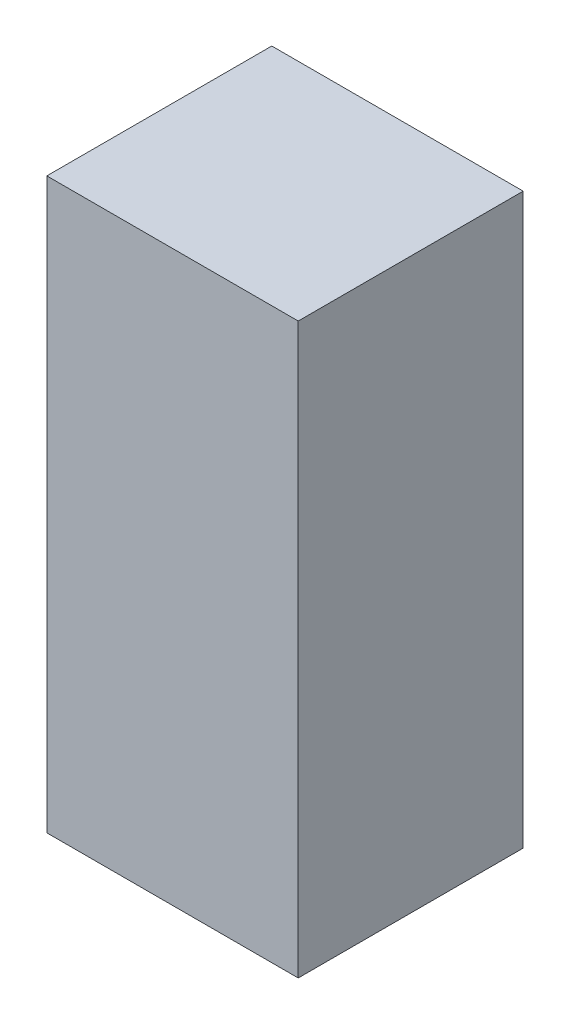
ISO-10303-21;
HEADER;
FILE_DESCRIPTION(('STEP AP214'),'2;1');
FILE_NAME('part.step','',(''),(''),'','','');
FILE_SCHEMA(('AUTOMOTIVE_DESIGN { 1 0 10303 214 1 1 1 1 }'));
ENDSEC;
DATA;
#1=APPLICATION_CONTEXT('core data for automotive mechanical design processes');
#2=APPLICATION_PROTOCOL_DEFINITION('international standard','automotive_design',2000,#1);
#3=PRODUCT_CONTEXT('',#1,'mechanical');
#4=PRODUCT('Part','Part','',(#3));
#5=PRODUCT_RELATED_PRODUCT_CATEGORY('part','',(#4));
#6=PRODUCT_DEFINITION_FORMATION('','',#4);
#7=PRODUCT_DEFINITION_CONTEXT('part definition',#1,'design');
#8=PRODUCT_DEFINITION('design','',#6,#7);
#9=PRODUCT_DEFINITION_SHAPE('','',#8);
#10=(LENGTH_UNIT() NAMED_UNIT(*) SI_UNIT(.MILLI.,.METRE.));
#11=(NAMED_UNIT(*) PLANE_ANGLE_UNIT() SI_UNIT($,.RADIAN.));
#12=(NAMED_UNIT(*) SI_UNIT($,.STERADIAN.) SOLID_ANGLE_UNIT());
#13=UNCERTAINTY_MEASURE_WITH_UNIT(LENGTH_MEASURE(1.E-05),#10,'distance_accuracy_value','');
#14=(GEOMETRIC_REPRESENTATION_CONTEXT(3) GLOBAL_UNCERTAINTY_ASSIGNED_CONTEXT((#13)) GLOBAL_UNIT_ASSIGNED_CONTEXT((#10,
#11,#12)) REPRESENTATION_CONTEXT('',''));
#15=CARTESIAN_POINT('',(0.,0.,0.));
#16=DIRECTION('',(0.,0.,1.));
#17=DIRECTION('',(1.,0.,0.));
#18=AXIS2_PLACEMENT_3D('',#15,#16,#17);
#19=CARTESIAN_POINT('',(-9.5,43.,8.5));
#20=DIRECTION('',(1.,0.,0.));
#21=DIRECTION('',(0.,0.,-1.));
#22=AXIS2_PLACEMENT_3D('',#19,#20,#21);
#23=PLANE('',#22);
#24=DIRECTION('',(0.,0.,1.));
#25=VECTOR('',#24,1.);
#26=CARTESIAN_POINT('',(-9.5,0.,8.5));
#27=LINE('',#26,#25);
#28=CARTESIAN_POINT('',(-9.5,0.,-8.5));
#29=VERTEX_POINT('',#28);
#30=CARTESIAN_POINT('',(-9.5,0.,8.5));
#31=VERTEX_POINT('',#30);
#32=EDGE_CURVE('E102',#29,#31,#27,.T.);
#33=ORIENTED_EDGE('',*,*,#32,.T.);
#34=DIRECTION('',(0.,-1.,0.));
#35=VECTOR('',#34,1.);
#36=CARTESIAN_POINT('',(-9.5,43.,8.5));
#37=LINE('',#36,#35);
#38=CARTESIAN_POINT('',(-9.5,43.,8.5));
#39=VERTEX_POINT('',#38);
#40=EDGE_CURVE('E11',#39,#31,#37,.T.);
#41=ORIENTED_EDGE('',*,*,#40,.F.);
#42=DIRECTION('',(0.,0.,1.));
#43=VECTOR('',#42,1.);
#44=CARTESIAN_POINT('',(-9.5,43.,8.5));
#45=LINE('',#44,#43);
#46=CARTESIAN_POINT('',(-9.5,43.,-8.5));
#47=VERTEX_POINT('',#46);
#48=EDGE_CURVE('E90',#47,#39,#45,.T.);
#49=ORIENTED_EDGE('',*,*,#48,.F.);
#50=DIRECTION('',(0.,-1.,0.));
#51=VECTOR('',#50,1.);
#52=CARTESIAN_POINT('',(-9.5,43.,-8.5));
#53=LINE('',#52,#51);
#54=EDGE_CURVE('E98',#47,#29,#53,.T.);
#55=ORIENTED_EDGE('',*,*,#54,.T.);
#56=EDGE_LOOP('',(#33,#41,#49,#55));
#57=FACE_BOUND('',#56,.T.);
#58=ADVANCED_FACE('F39',(#57),#23,.F.);
#59=CARTESIAN_POINT('',(9.5,43.,8.5));
#60=DIRECTION('',(0.,0.,-1.));
#61=DIRECTION('',(-1.,0.,0.));
#62=AXIS2_PLACEMENT_3D('',#59,#60,#61);
#63=PLANE('',#62);
#64=DIRECTION('',(1.,0.,0.));
#65=VECTOR('',#64,1.);
#66=CARTESIAN_POINT('',(9.5,0.,8.5));
#67=LINE('',#66,#65);
#68=CARTESIAN_POINT('',(9.5,0.,8.5));
#69=VERTEX_POINT('',#68);
#70=EDGE_CURVE('E94',#31,#69,#67,.T.);
#71=ORIENTED_EDGE('',*,*,#70,.T.);
#72=DIRECTION('',(0.,-1.,0.));
#73=VECTOR('',#72,1.);
#74=CARTESIAN_POINT('',(9.5,43.,8.5));
#75=LINE('',#74,#73);
#76=CARTESIAN_POINT('',(9.5,43.,8.5));
#77=VERTEX_POINT('',#76);
#78=EDGE_CURVE('E47',#77,#69,#75,.T.);
#79=ORIENTED_EDGE('',*,*,#78,.F.);
#80=DIRECTION('',(1.,0.,0.));
#81=VECTOR('',#80,1.);
#82=CARTESIAN_POINT('',(9.5,43.,8.5));
#83=LINE('',#82,#81);
#84=EDGE_CURVE('E85',#39,#77,#83,.T.);
#85=ORIENTED_EDGE('',*,*,#84,.F.);
#86=ORIENTED_EDGE('',*,*,#40,.T.);
#87=EDGE_LOOP('',(#71,#79,#85,#86));
#88=FACE_BOUND('',#87,.T.);
#89=ADVANCED_FACE('F93',(#88),#63,.F.);
#90=CARTESIAN_POINT('',(9.5,43.,8.5));
#91=DIRECTION('',(-1.,0.,0.));
#92=DIRECTION('',(0.,0.,1.));
#93=AXIS2_PLACEMENT_3D('',#90,#91,#92);
#94=PLANE('',#93);
#95=DIRECTION('',(0.,0.,-1.));
#96=VECTOR('',#95,1.);
#97=CARTESIAN_POINT('',(9.5,0.,8.5));
#98=LINE('',#97,#96);
#99=CARTESIAN_POINT('',(9.5,0.,-8.5));
#100=VERTEX_POINT('',#99);
#101=EDGE_CURVE('E72',#69,#100,#98,.T.);
#102=ORIENTED_EDGE('',*,*,#101,.T.);
#103=DIRECTION('',(0.,-1.,0.));
#104=VECTOR('',#103,1.);
#105=CARTESIAN_POINT('',(9.5,43.,-8.5));
#106=LINE('',#105,#104);
#107=CARTESIAN_POINT('',(9.5,43.,-8.5));
#108=VERTEX_POINT('',#107);
#109=EDGE_CURVE('E95',#108,#100,#106,.T.);
#110=ORIENTED_EDGE('',*,*,#109,.F.);
#111=DIRECTION('',(0.,0.,-1.));
#112=VECTOR('',#111,1.);
#113=CARTESIAN_POINT('',(9.5,43.,8.5));
#114=LINE('',#113,#112);
#115=EDGE_CURVE('E88',#77,#108,#114,.T.);
#116=ORIENTED_EDGE('',*,*,#115,.F.);
#117=ORIENTED_EDGE('',*,*,#78,.T.);
#118=EDGE_LOOP('',(#102,#110,#116,#117));
#119=FACE_BOUND('',#118,.T.);
#120=ADVANCED_FACE('F96',(#119),#94,.F.);
#121=CARTESIAN_POINT('',(9.5,43.,-8.5));
#122=DIRECTION('',(0.,0.,1.));
#123=DIRECTION('',(1.,0.,0.));
#124=AXIS2_PLACEMENT_3D('',#121,#122,#123);
#125=PLANE('',#124);
#126=DIRECTION('',(-1.,0.,0.));
#127=VECTOR('',#126,1.);
#128=CARTESIAN_POINT('',(9.5,0.,-8.5));
#129=LINE('',#128,#127);
#130=EDGE_CURVE('E78',#100,#29,#129,.T.);
#131=ORIENTED_EDGE('',*,*,#130,.T.);
#132=ORIENTED_EDGE('',*,*,#54,.F.);
#133=DIRECTION('',(-1.,0.,0.));
#134=VECTOR('',#133,1.);
#135=CARTESIAN_POINT('',(9.5,43.,-8.5));
#136=LINE('',#135,#134);
#137=EDGE_CURVE('E55',#108,#47,#136,.T.);
#138=ORIENTED_EDGE('',*,*,#137,.F.);
#139=ORIENTED_EDGE('',*,*,#109,.T.);
#140=EDGE_LOOP('',(#131,#132,#138,#139));
#141=FACE_BOUND('',#140,.T.);
#142=ADVANCED_FACE('F109',(#141),#125,.F.);
#143=CARTESIAN_POINT('',(0.,43.,0.));
#144=DIRECTION('',(0.,1.,0.));
#145=DIRECTION('',(0.,0.,1.));
#146=AXIS2_PLACEMENT_3D('',#143,#144,#145);
#147=PLANE('',#146);
#148=ORIENTED_EDGE('',*,*,#48,.T.);
#149=ORIENTED_EDGE('',*,*,#84,.T.);
#150=ORIENTED_EDGE('',*,*,#115,.T.);
#151=ORIENTED_EDGE('',*,*,#137,.T.);
#152=EDGE_LOOP('',(#148,#149,#150,#151));
#153=FACE_BOUND('',#152,.T.);
#154=ADVANCED_FACE('F86',(#153),#147,.T.);
#155=CARTESIAN_POINT('',(0.,0.,0.));
#156=DIRECTION('',(0.,1.,0.));
#157=DIRECTION('',(0.,0.,1.));
#158=AXIS2_PLACEMENT_3D('',#155,#156,#157);
#159=PLANE('',#158);
#160=ORIENTED_EDGE('',*,*,#32,.F.);
#161=ORIENTED_EDGE('',*,*,#130,.F.);
#162=ORIENTED_EDGE('',*,*,#101,.F.);
#163=ORIENTED_EDGE('',*,*,#70,.F.);
#164=EDGE_LOOP('',(#160,#161,#162,#163));
#165=FACE_BOUND('',#164,.T.);
#166=ADVANCED_FACE('F112',(#165),#159,.F.);
#167=CLOSED_SHELL('',(#58,#89,#120,#142,#154,#166));
#168=MANIFOLD_SOLID_BREP('B2',#167);
#169=ADVANCED_BREP_SHAPE_REPRESENTATION('',(#18,#168),#14);
#170=SHAPE_DEFINITION_REPRESENTATION(#9,#169);
ENDSEC;
END-ISO-10303-21;
